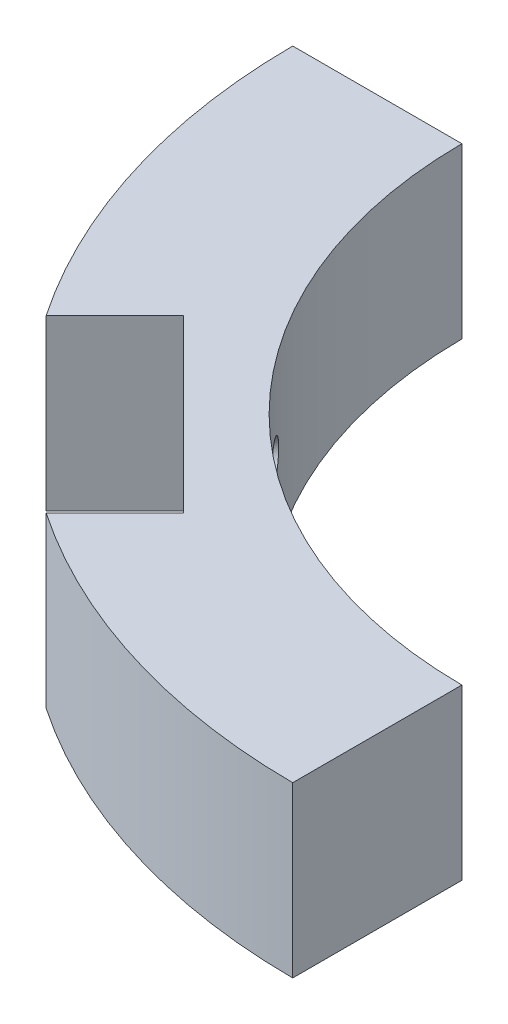
ISO-10303-21;
HEADER;
FILE_DESCRIPTION(('STEP AP214'),'2;1');
FILE_NAME('part.step','',(''),(''),'','','');
FILE_SCHEMA(('AUTOMOTIVE_DESIGN { 1 0 10303 214 1 1 1 1 }'));
ENDSEC;
DATA;
#1=APPLICATION_CONTEXT('core data for automotive mechanical design processes');
#2=APPLICATION_PROTOCOL_DEFINITION('international standard','automotive_design',2000,#1);
#3=PRODUCT_CONTEXT('',#1,'mechanical');
#4=PRODUCT('Part','Part','',(#3));
#5=PRODUCT_RELATED_PRODUCT_CATEGORY('part','',(#4));
#6=PRODUCT_DEFINITION_FORMATION('','',#4);
#7=PRODUCT_DEFINITION_CONTEXT('part definition',#1,'design');
#8=PRODUCT_DEFINITION('design','',#6,#7);
#9=PRODUCT_DEFINITION_SHAPE('','',#8);
#10=(LENGTH_UNIT() NAMED_UNIT(*) SI_UNIT(.MILLI.,.METRE.));
#11=(NAMED_UNIT(*) PLANE_ANGLE_UNIT() SI_UNIT($,.RADIAN.));
#12=(NAMED_UNIT(*) SI_UNIT($,.STERADIAN.) SOLID_ANGLE_UNIT());
#13=UNCERTAINTY_MEASURE_WITH_UNIT(LENGTH_MEASURE(1.E-05),#10,'distance_accuracy_value','');
#14=(GEOMETRIC_REPRESENTATION_CONTEXT(3) GLOBAL_UNCERTAINTY_ASSIGNED_CONTEXT((#13)) GLOBAL_UNIT_ASSIGNED_CONTEXT((#10,
#11,#12)) REPRESENTATION_CONTEXT('',''));
#15=CARTESIAN_POINT('',(0.,0.,0.));
#16=DIRECTION('',(0.,0.,1.));
#17=DIRECTION('',(1.,0.,0.));
#18=AXIS2_PLACEMENT_3D('',#15,#16,#17);
#19=CARTESIAN_POINT('',(0.,3.5,0.));
#20=DIRECTION('',(0.,-1.,0.));
#21=DIRECTION('',(0.,0.,-1.));
#22=AXIS2_PLACEMENT_3D('',#19,#20,#21);
#23=CYLINDRICAL_SURFACE('',#22,26.5);
#24=CARTESIAN_POINT('',(0.,3.5,0.));
#25=DIRECTION('',(0.,1.,0.));
#26=DIRECTION('',(0.,0.,1.));
#27=AXIS2_PLACEMENT_3D('',#24,#25,#26);
#28=CIRCLE('',#27,26.5);
#29=CARTESIAN_POINT('',(-14.8662323136452,3.5,21.9373001255107));
#30=VERTEX_POINT('',#29);
#31=CARTESIAN_POINT('',(-0.0999999999999968,3.5,26.499811320083));
#32=VERTEX_POINT('',#31);
#33=EDGE_CURVE('E99',#30,#32,#28,.T.);
#34=ORIENTED_EDGE('',*,*,#33,.F.);
#35=DIRECTION('',(0.,-1.,0.));
#36=VECTOR('',#35,1.);
#37=CARTESIAN_POINT('',(-14.8662323136452,3.5,21.9373001255107));
#38=LINE('',#37,#36);
#39=CARTESIAN_POINT('',(-14.8662323136452,-3.5,21.9373001255107));
#40=VERTEX_POINT('',#39);
#41=EDGE_CURVE('E150',#30,#40,#38,.T.);
#42=ORIENTED_EDGE('',*,*,#41,.T.);
#43=CARTESIAN_POINT('',(0.,-3.5,0.));
#44=DIRECTION('',(0.,1.,0.));
#45=DIRECTION('',(0.,0.,1.));
#46=AXIS2_PLACEMENT_3D('',#43,#44,#45);
#47=CIRCLE('',#46,26.5);
#48=CARTESIAN_POINT('',(-0.0999999999999968,-3.5,26.499811320083));
#49=VERTEX_POINT('',#48);
#50=EDGE_CURVE('E142',#40,#49,#47,.T.);
#51=ORIENTED_EDGE('',*,*,#50,.T.);
#52=DIRECTION('',(0.,-1.,0.));
#53=VECTOR('',#52,1.);
#54=CARTESIAN_POINT('',(-0.0999999999999968,3.5,26.499811320083));
#55=LINE('',#54,#53);
#56=EDGE_CURVE('E54',#32,#49,#55,.T.);
#57=ORIENTED_EDGE('',*,*,#56,.F.);
#58=EDGE_LOOP('',(#34,#42,#51,#57));
#59=FACE_BOUND('',#58,.T.);
#60=ADVANCED_FACE('F39',(#59),#23,.T.);
#61=CARTESIAN_POINT('',(-26.499811320083,-3.5,0.100000000000003));
#62=VERTEX_POINT('',#61);
#63=CARTESIAN_POINT('',(-21.9373001255107,-3.5,14.8662323136452));
#64=VERTEX_POINT('',#63);
#65=EDGE_CURVE('E149',#62,#64,#47,.T.);
#66=ORIENTED_EDGE('',*,*,#65,.T.);
#67=DIRECTION('',(0.,-1.,0.));
#68=VECTOR('',#67,1.);
#69=CARTESIAN_POINT('',(-21.9373001255107,3.5,14.8662323136452));
#70=LINE('',#69,#68);
#71=CARTESIAN_POINT('',(-21.9373001255107,3.5,14.8662323136452));
#72=VERTEX_POINT('',#71);
#73=EDGE_CURVE('E155',#64,#72,#70,.F.);
#74=ORIENTED_EDGE('',*,*,#73,.T.);
#75=CARTESIAN_POINT('',(-26.499811320083,3.5,0.100000000000003));
#76=VERTEX_POINT('',#75);
#77=EDGE_CURVE('E221',#76,#72,#28,.T.);
#78=ORIENTED_EDGE('',*,*,#77,.F.);
#79=DIRECTION('',(0.,-1.,0.));
#80=VECTOR('',#79,1.);
#81=CARTESIAN_POINT('',(-26.499811320083,3.5,0.100000000000003));
#82=LINE('',#81,#80);
#83=EDGE_CURVE('E167',#76,#62,#82,.T.);
#84=ORIENTED_EDGE('',*,*,#83,.T.);
#85=EDGE_LOOP('',(#66,#74,#78,#84));
#86=FACE_BOUND('',#85,.T.);
#87=ADVANCED_FACE('F41',(#86),#23,.T.);
#88=CARTESIAN_POINT('',(-0.0999999999999976,3.5,19.4997435880578));
#89=DIRECTION('',(-1.,0.,0.));
#90=DIRECTION('',(0.,0.,1.));
#91=AXIS2_PLACEMENT_3D('',#88,#89,#90);
#92=PLANE('',#91);
#93=DIRECTION('',(0.,0.,-1.));
#94=VECTOR('',#93,1.);
#95=CARTESIAN_POINT('',(-0.0999999999999976,-3.5,19.4997435880578));
#96=LINE('',#95,#94);
#97=CARTESIAN_POINT('',(-0.0999999999999976,-3.5,19.4997435880578));
#98=VERTEX_POINT('',#97);
#99=EDGE_CURVE('E144',#49,#98,#96,.T.);
#100=ORIENTED_EDGE('',*,*,#99,.T.);
#101=DIRECTION('',(0.,-1.,0.));
#102=VECTOR('',#101,1.);
#103=CARTESIAN_POINT('',(-0.0999999999999976,3.5,19.4997435880578));
#104=LINE('',#103,#102);
#105=CARTESIAN_POINT('',(-0.0999999999999976,3.5,19.4997435880578));
#106=VERTEX_POINT('',#105);
#107=EDGE_CURVE('E173',#106,#98,#104,.T.);
#108=ORIENTED_EDGE('',*,*,#107,.F.);
#109=DIRECTION('',(0.,0.,-1.));
#110=VECTOR('',#109,1.);
#111=CARTESIAN_POINT('',(-0.0999999999999976,3.5,19.4997435880578));
#112=LINE('',#111,#110);
#113=EDGE_CURVE('E224',#32,#106,#112,.T.);
#114=ORIENTED_EDGE('',*,*,#113,.F.);
#115=ORIENTED_EDGE('',*,*,#56,.T.);
#116=EDGE_LOOP('',(#100,#108,#114,#115));
#117=FACE_BOUND('',#116,.T.);
#118=ADVANCED_FACE('F213',(#117),#92,.F.);
#119=CARTESIAN_POINT('',(0.,3.5,0.));
#120=DIRECTION('',(0.,-1.,0.));
#121=DIRECTION('',(0.,0.,-1.));
#122=AXIS2_PLACEMENT_3D('',#119,#120,#121);
#123=CYLINDRICAL_SURFACE('',#122,19.5);
#124=CARTESIAN_POINT('',(-14.9381653949713,0.,12.5340023389371));
#125=CARTESIAN_POINT('',(-14.9381667780686,0.0447926887067032,12.5340009062882));
#126=CARTESIAN_POINT('',(-14.940601786529,0.0896174151561325,12.5311003946035));
#127=CARTESIAN_POINT('',(-14.9502708829078,0.178030383018517,12.5195628914961));
#128=CARTESIAN_POINT('',(-14.9575106622341,0.221617094034541,12.5109190969531));
#129=CARTESIAN_POINT('',(-14.9765506304799,0.306259561267728,12.4881203751009));
#130=CARTESIAN_POINT('',(-14.9883484445512,0.347316622599621,12.4739683177038));
#131=CARTESIAN_POINT('',(-15.0161174144119,0.425747881223164,12.4405260283543));
#132=CARTESIAN_POINT('',(-15.0320875509083,0.463122974948067,12.4212370513226));
#133=CARTESIAN_POINT('',(-15.0677106128549,0.533196901395608,12.3779998420985));
#134=CARTESIAN_POINT('',(-15.0873680784392,0.565889880663399,12.3540458645801));
#135=CARTESIAN_POINT('',(-15.1297296402066,0.625634218496681,12.30212994319));
#136=CARTESIAN_POINT('',(-15.1524338907005,0.652685291138801,12.2741677963114));
#137=CARTESIAN_POINT('',(-15.200269382794,0.70048845302892,12.2148788162801));
#138=CARTESIAN_POINT('',(-15.2254090629831,0.721217527781188,12.1835402386997));
#139=CARTESIAN_POINT('',(-15.2772811307708,0.755686299213845,12.1184327458993));
#140=CARTESIAN_POINT('',(-15.3040135632259,0.769425798943669,12.0846637622264));
#141=CARTESIAN_POINT('',(-15.3584470765087,0.789619559561356,12.0154090088681));
#142=CARTESIAN_POINT('',(-15.3861530238841,0.796029418390657,11.9799141196695));
#143=CARTESIAN_POINT('',(-15.4415822781847,0.801261046419452,11.9083829344446));
#144=CARTESIAN_POINT('',(-15.4693055857741,0.800082504958599,11.872346616313));
#145=CARTESIAN_POINT('',(-15.5241870766144,0.790154617626917,11.8004946302563));
#146=CARTESIAN_POINT('',(-15.5513400872486,0.781353461705406,11.7646821652043));
#147=CARTESIAN_POINT('',(-15.6041430890249,0.75636462196657,11.6945562719919));
#148=CARTESIAN_POINT('',(-15.6297930286496,0.740176685135969,11.6602428952226));
#149=CARTESIAN_POINT('',(-15.6789944202361,0.700790736440036,11.5940003415255));
#150=CARTESIAN_POINT('',(-15.7025381267873,0.677568125894556,11.5620800292853));
#151=CARTESIAN_POINT('',(-15.7468018344436,0.624770398574442,11.5017231263902));
#152=CARTESIAN_POINT('',(-15.7675218649236,0.595195347892925,11.4732864994946));
#153=CARTESIAN_POINT('',(-15.8055127174139,0.530642657884267,11.420893705515));
#154=CARTESIAN_POINT('',(-15.8227973646052,0.495687720954634,11.3969196054694));
#155=CARTESIAN_POINT('',(-15.8535648475609,0.421263333317196,11.3540820649097));
#156=CARTESIAN_POINT('',(-15.8670479304329,0.381794176275341,11.3352182922194));
#157=CARTESIAN_POINT('',(-15.8897176516203,0.299945745038172,11.3034177040642));
#158=CARTESIAN_POINT('',(-15.8989520798266,0.257605314065336,11.2904149974524));
#159=CARTESIAN_POINT('',(-15.9131034795064,0.170829223204259,11.270460896307));
#160=CARTESIAN_POINT('',(-15.9180207925848,0.126393729387535,11.263509022983));
#161=CARTESIAN_POINT('',(-15.9233721370508,0.0372653435309439,11.255942486705));
#162=CARTESIAN_POINT('',(-15.9238596712659,-0.007417935803391,11.2552521965781));
#163=CARTESIAN_POINT('',(-15.9204784963119,-0.0962858662053033,11.2600343144363));
#164=CARTESIAN_POINT('',(-15.9166099345456,-0.140470534093941,11.2655065138934));
#165=CARTESIAN_POINT('',(-15.9046437313152,-0.226911488059198,11.282393945902));
#166=CARTESIAN_POINT('',(-15.8965627109719,-0.269174648372177,11.2937858206073));
#167=CARTESIAN_POINT('',(-15.8763927453055,-0.350780818016871,11.3221223321958));
#168=CARTESIAN_POINT('',(-15.8643036797798,-0.390123739726423,11.3390671356127));
#169=CARTESIAN_POINT('',(-15.8363280618732,-0.465084120177275,11.3781058218266));
#170=CARTESIAN_POINT('',(-15.8204150798007,-0.500673053915882,11.4002355130632));
#171=CARTESIAN_POINT('',(-15.7852440962625,-0.566844626809012,11.4488849962167));
#172=CARTESIAN_POINT('',(-15.7659858669314,-0.597426924655128,11.4754050871847));
#173=CARTESIAN_POINT('',(-15.7243436239521,-0.653131795604779,11.5324011684197));
#174=CARTESIAN_POINT('',(-15.7019227228704,-0.678179396169699,11.5629234898));
#175=CARTESIAN_POINT('',(-15.6547240595134,-0.721638301572632,11.6267445234585));
#176=CARTESIAN_POINT('',(-15.6299461597275,-0.74004921891696,11.6600433977106));
#177=CARTESIAN_POINT('',(-15.5784239921698,-0.769884220384496,11.7287922424816));
#178=CARTESIAN_POINT('',(-15.5516627391421,-0.781237595753329,11.7642601913367));
#179=CARTESIAN_POINT('',(-15.4971179346211,-0.796346708849048,11.8360198636244));
#180=CARTESIAN_POINT('',(-15.469334363194,-0.800102298348236,11.8723116031148));
#181=CARTESIAN_POINT('',(-15.4134685669638,-0.799893268563037,11.9447512549184));
#182=CARTESIAN_POINT('',(-15.3853858849238,-0.795914361243836,11.980898777202));
#183=CARTESIAN_POINT('',(-15.3297883795077,-0.780295549953545,12.0519551920139));
#184=CARTESIAN_POINT('',(-15.3022735444758,-0.768655803391906,12.0868641099767));
#185=CARTESIAN_POINT('',(-15.2487709295146,-0.738096488900711,12.1542926606039));
#186=CARTESIAN_POINT('',(-15.2227763551842,-0.719212709721057,12.1868231177741));
#187=CARTESIAN_POINT('',(-15.1729727025359,-0.674678325852769,12.2487746694918));
#188=CARTESIAN_POINT('',(-15.1491634602423,-0.649028229433325,12.2781959973571));
#189=CARTESIAN_POINT('',(-15.1046431727114,-0.591884726195248,12.3329231206628));
#190=CARTESIAN_POINT('',(-15.0839114345638,-0.560433865970018,12.3582565138407));
#191=CARTESIAN_POINT('',(-15.0460064603107,-0.492447897996263,12.404377587756));
#192=CARTESIAN_POINT('',(-15.0288339950034,-0.455911691819864,12.4251642839119));
#193=CARTESIAN_POINT('',(-14.9986895506647,-0.37900079134491,12.4615355718145));
#194=CARTESIAN_POINT('',(-14.9856972351844,-0.33864595612349,12.4771453610296));
#195=CARTESIAN_POINT('',(-14.9642342589253,-0.255123763596308,12.5028787284016));
#196=CARTESIAN_POINT('',(-14.9557581464211,-0.211959868231087,12.5130089214679));
#197=CARTESIAN_POINT('',(-14.9458518821573,-0.140434863682562,12.5248370970091));
#198=CARTESIAN_POINT('',(-14.9429735630656,-0.112540972881949,12.5282700394258));
#199=CARTESIAN_POINT('',(-14.9391298851349,-0.0564356277711274,12.5328531100659));
#200=CARTESIAN_POINT('',(-14.9381645234725,-0.0282241739296987,12.5340032416587));
#201=CARTESIAN_POINT('',(-14.9381653949713,0.,12.5340023389371));
#202=B_SPLINE_CURVE_WITH_KNOTS('',3,(#124,#125,#126,#127,#128,#129,#130,#131,#132,#133,#134,
#135,#136,#137,#138,#139,#140,#141,#142,#143,#144,#145,#146,#147,#148,#149,#150,#151,#152,#153,
#154,#155,#156,#157,#158,#159,#160,#161,#162,#163,#164,#165,#166,#167,#168,#169,#170,#171,#172,
#173,#174,#175,#176,#177,#178,#179,#180,#181,#182,#183,#184,#185,#186,#187,#188,#189,#190,#191,
#192,#193,#194,#195,#196,#197,#198,#199,#200,#201),.UNSPECIFIED.,.T.,.F.,(4,2,2,2,2,2,2,2,2,2,2,
2,2,2,2,2,2,2,2,2,2,2,2,2,2,2,2,2,2,2,2,2,2,2,2,2,2,2,4),(0.,0.134274968871725,
0.268709275390316,0.403073632580654,0.537405195374185,0.671903256723807,0.806408132578212,
0.941396968596201,1.07638960808652,1.21219575473568,1.34800746116708,1.48474957379641,
1.62149637049145,1.75872697073489,1.89595614325003,2.0326213482637,2.16927766777484,
2.30435681958522,2.43942528187961,2.57286018754196,2.70629057813082,2.83919843274955,
2.97211027367612,3.10596860943248,3.23983606667657,3.37541868829253,3.51100922484157,
3.64793721310396,3.78486787271365,3.92205172648165,4.05923276158187,4.19574461247371,
4.33224621184802,4.46778379474357,4.60335069913835,4.73824773093714,4.8729815509876,
4.95758923538794,5.04219679490854),.UNSPECIFIED.);
#203=CARTESIAN_POINT('',(-14.9381653949713,0.,12.5340023389371));
#204=VERTEX_POINT('',#203);
#205=EDGE_CURVE('E43',#204,#204,#202,.T.);
#206=ORIENTED_EDGE('',*,*,#205,.T.);
#207=EDGE_LOOP('',(#206));
#208=FACE_BOUND('',#207,.T.);
#209=CARTESIAN_POINT('',(-11.2562496055717,0.,15.923154361403));
#210=CARTESIAN_POINT('',(-11.2562513989547,0.0444882603622283,15.923153262429));
#211=CARTESIAN_POINT('',(-11.2593361298349,0.0890086003418468,15.9209738533562));
#212=CARTESIAN_POINT('',(-11.2715814252711,0.17681236621352,15.9123067526694));
#213=CARTESIAN_POINT('',(-11.2807492348988,0.220094252883904,15.9058139236725));
#214=CARTESIAN_POINT('',(-11.3048468799743,0.304126780095141,15.8886957932278));
#215=CARTESIAN_POINT('',(-11.3197719435446,0.344879484550197,15.8780739140707));
#216=CARTESIAN_POINT('',(-11.3548927837817,0.422750549666529,15.8529768013485));
#217=CARTESIAN_POINT('',(-11.3750874752577,0.459869656444034,15.838502361141));
#218=CARTESIAN_POINT('',(-11.4202776055081,0.529738576288484,15.8059494565509));
#219=CARTESIAN_POINT('',(-11.4453070772825,0.562454445970485,15.7878454061571));
#220=CARTESIAN_POINT('',(-11.4993015218041,0.622319780119209,15.7485611144964));
#221=CARTESIAN_POINT('',(-11.5282668939615,0.64946867895422,15.7273805610147));
#222=CARTESIAN_POINT('',(-11.58966472861,0.697788219043295,15.6821918281202));
#223=CARTESIAN_POINT('',(-11.6221367544623,0.718878061134497,15.6581509837661));
#224=CARTESIAN_POINT('',(-11.689280707098,0.75404014908192,15.608089850927));
#225=CARTESIAN_POINT('',(-11.7239527402789,0.768112055242816,15.5820694666947));
#226=CARTESIAN_POINT('',(-11.7947696003497,0.788928865744334,15.5285348276059));
#227=CARTESIAN_POINT('',(-11.8309236424234,0.795617075674029,15.501010693682));
#228=CARTESIAN_POINT('',(-11.9034143621222,0.801272664511802,15.4454139703401));
#229=CARTESIAN_POINT('',(-11.939751039974,0.800240033828525,15.4173413802408));
#230=CARTESIAN_POINT('',(-12.0115512339807,0.790463942969342,15.3614682033334));
#231=CARTESIAN_POINT('',(-12.0470152852696,0.781725336032816,15.3336674564585));
#232=CARTESIAN_POINT('',(-12.1160918129241,0.756765494190017,15.2791444915054));
#233=CARTESIAN_POINT('',(-12.1497043422757,0.740544473536647,15.2524222425691));
#234=CARTESIAN_POINT('',(-12.2139381478425,0.70117989102477,15.2010328101872));
#235=CARTESIAN_POINT('',(-12.2445763155069,0.678078872231745,15.176354155167));
#236=CARTESIAN_POINT('',(-12.3022446140576,0.625559421838201,15.129644958093));
#237=CARTESIAN_POINT('',(-12.3292748760735,0.596141219937747,15.1076143197997));
#238=CARTESIAN_POINT('',(-12.378819006432,0.532037399755519,15.0670455242559));
#239=CARTESIAN_POINT('',(-12.4013620752591,0.497388603767978,15.0484848377862));
#240=CARTESIAN_POINT('',(-12.4415534860614,0.42366138142606,15.0152731843781));
#241=CARTESIAN_POINT('',(-12.4592019545865,0.384583069633649,15.0006221163569));
#242=CARTESIAN_POINT('',(-12.4890655194484,0.303302873093291,14.9757677602491));
#243=CARTESIAN_POINT('',(-12.5013054488625,0.261116324516301,14.9655441480993));
#244=CARTESIAN_POINT('',(-12.5201513692255,0.174661067535276,14.9497813340595));
#245=CARTESIAN_POINT('',(-12.5267574399285,0.130392388615719,14.9442420658569));
#246=CARTESIAN_POINT('',(-12.5341555885122,0.0411369925096781,14.9380376025166));
#247=CARTESIAN_POINT('',(-12.5349607894451,-0.00384787307781429,14.9373614058722));
#248=CARTESIAN_POINT('',(-12.5307711865429,-0.093354814241568,14.9408761678379));
#249=CARTESIAN_POINT('',(-12.5257764178699,-0.137876892621808,14.9450670969412));
#250=CARTESIAN_POINT('',(-12.5101202215359,-0.225170737623737,14.9581748587763));
#251=CARTESIAN_POINT('',(-12.4994617533651,-0.267943405816575,14.9670892233336));
#252=CARTESIAN_POINT('',(-12.4727567551295,-0.350551866570748,14.989350865013));
#253=CARTESIAN_POINT('',(-12.4567102273285,-0.390387660365992,15.0026981402728));
#254=CARTESIAN_POINT('',(-12.4196307616803,-0.466035515175262,15.0334077823465));
#255=CARTESIAN_POINT('',(-12.3985930664982,-0.501843688963106,15.0507739794086));
#256=CARTESIAN_POINT('',(-12.3520952177479,-0.568388545403883,15.0889577622282));
#257=CARTESIAN_POINT('',(-12.3266350238901,-0.599125181849311,15.1097753794287));
#258=CARTESIAN_POINT('',(-12.2718917036601,-0.654755485097515,15.1542706625385));
#259=CARTESIAN_POINT('',(-12.242597835861,-0.679632163250609,15.1779563499035));
#260=CARTESIAN_POINT('',(-12.181034486075,-0.722749321178305,15.2274080485627));
#261=CARTESIAN_POINT('',(-12.1487649352695,-0.740989647426168,15.2531741079678));
#262=CARTESIAN_POINT('',(-12.0819489158533,-0.770427261873299,15.3061535400458));
#263=CARTESIAN_POINT('',(-12.0473912784662,-0.781586681310462,15.3333738643003));
#264=CARTESIAN_POINT('',(-11.9771057465913,-0.796423696104602,15.3883373948898));
#265=CARTESIAN_POINT('',(-11.941377802802,-0.800100975848621,15.4160806232322));
#266=CARTESIAN_POINT('',(-11.8694934190225,-0.799894087392364,15.4714963576925));
#267=CARTESIAN_POINT('',(-11.8333357250625,-0.79595737860279,15.4991670435424));
#268=CARTESIAN_POINT('',(-11.7618613965189,-0.78054373904679,15.553476528203));
#269=CARTESIAN_POINT('',(-11.726544796566,-0.76906649836463,15.5801152845538));
#270=CARTESIAN_POINT('',(-11.6575892545338,-0.738815855356357,15.6317778772307));
#271=CARTESIAN_POINT('',(-11.6239599183035,-0.720005079466371,15.656792663145));
#272=CARTESIAN_POINT('',(-11.5595740670861,-0.675609428118719,15.7043895841664));
#273=CARTESIAN_POINT('',(-11.5288174639403,-0.650024760631485,15.726971793928));
#274=CARTESIAN_POINT('',(-11.4711573745523,-0.592825679326733,15.769078076246));
#275=CARTESIAN_POINT('',(-11.4442482528643,-0.5612202459024,15.7886066255421));
#276=CARTESIAN_POINT('',(-11.3950733929839,-0.492819504523564,15.8241342673123));
#277=CARTESIAN_POINT('',(-11.3728085806775,-0.456023164160033,15.8401326560528));
#278=CARTESIAN_POINT('',(-11.3338414237774,-0.378648814871189,15.8680373571669));
#279=CARTESIAN_POINT('',(-11.3170900905247,-0.338108450998922,15.8799797402928));
#280=CARTESIAN_POINT('',(-11.2894500401071,-0.254149508648306,15.8996417699566));
#281=CARTESIAN_POINT('',(-11.2785537225385,-0.210734744111615,15.9073668911369));
#282=CARTESIAN_POINT('',(-11.2659446837547,-0.139187939141677,15.9162973885428));
#283=CARTESIAN_POINT('',(-11.2623143872689,-0.111542334174153,15.91886564967));
#284=CARTESIAN_POINT('',(-11.2574662948808,-0.0559353788880285,15.9222944741549));
#285=CARTESIAN_POINT('',(-11.2562484779001,-0.0279740313303002,15.9231550524332));
#286=CARTESIAN_POINT('',(-11.2562496055717,0.,15.923154361403));
#287=B_SPLINE_CURVE_WITH_KNOTS('',3,(#209,#210,#211,#212,#213,#214,#215,#216,#217,#218,#219,
#220,#221,#222,#223,#224,#225,#226,#227,#228,#229,#230,#231,#232,#233,#234,#235,#236,#237,#238,
#239,#240,#241,#242,#243,#244,#245,#246,#247,#248,#249,#250,#251,#252,#253,#254,#255,#256,#257,
#258,#259,#260,#261,#262,#263,#264,#265,#266,#267,#268,#269,#270,#271,#272,#273,#274,#275,#276,
#277,#278,#279,#280,#281,#282,#283,#284,#285,#286),.UNSPECIFIED.,.T.,.F.,(4,2,2,2,2,2,2,2,2,2,2,
2,2,2,2,2,2,2,2,2,2,2,2,2,2,2,2,2,2,2,2,2,2,2,2,2,2,2,4),(0.,0.133361839352201,
0.266882801186459,0.400293331664344,0.533676410153089,0.668035071461231,0.802407377515444,
0.938496213348162,1.07459163576929,1.21172492785527,1.34885839029764,1.48590554744275,
1.62294878059624,1.75916159390531,1.89536945519775,2.03065967207611,2.16594639069892,
2.30060532260018,2.43526234820692,2.5696146492158,2.70396613572332,2.83824748760361,
2.97252878306618,3.10693858672213,3.24134961493747,3.37614564697282,3.51094479720921,
3.64645890991594,3.78197873878475,3.91843706411698,4.05490099823497,4.19206967483966,
4.32923414061206,4.46619559560725,4.60318432909538,4.7389207810206,4.87448060498398,
4.95833870233798,5.04219606699845),.UNSPECIFIED.);
#288=CARTESIAN_POINT('',(-11.2562496055717,0.,15.923154361403));
#289=VERTEX_POINT('',#288);
#290=EDGE_CURVE('E178',#289,#289,#287,.T.);
#291=ORIENTED_EDGE('',*,*,#290,.T.);
#292=EDGE_LOOP('',(#291));
#293=FACE_BOUND('',#292,.T.);
#294=CARTESIAN_POINT('',(0.,-3.5,0.));
#295=DIRECTION('',(0.,-1.,0.));
#296=DIRECTION('',(0.,0.,1.));
#297=AXIS2_PLACEMENT_3D('',#294,#295,#296);
#298=CIRCLE('',#297,19.5);
#299=CARTESIAN_POINT('',(-19.4997435880578,-3.5,0.100000000000004));
#300=VERTEX_POINT('',#299);
#301=EDGE_CURVE('E162',#98,#300,#298,.T.);
#302=ORIENTED_EDGE('',*,*,#301,.T.);
#303=DIRECTION('',(0.,-1.,0.));
#304=VECTOR('',#303,1.);
#305=CARTESIAN_POINT('',(-19.4997435880578,3.5,0.100000000000004));
#306=LINE('',#305,#304);
#307=CARTESIAN_POINT('',(-19.4997435880578,3.5,0.100000000000004));
#308=VERTEX_POINT('',#307);
#309=EDGE_CURVE('E170',#308,#300,#306,.T.);
#310=ORIENTED_EDGE('',*,*,#309,.F.);
#311=CARTESIAN_POINT('',(0.,3.5,0.));
#312=DIRECTION('',(0.,-1.,0.));
#313=DIRECTION('',(0.,0.,1.));
#314=AXIS2_PLACEMENT_3D('',#311,#312,#313);
#315=CIRCLE('',#314,19.5);
#316=EDGE_CURVE('E228',#106,#308,#315,.T.);
#317=ORIENTED_EDGE('',*,*,#316,.F.);
#318=ORIENTED_EDGE('',*,*,#107,.T.);
#319=EDGE_LOOP('',(#302,#310,#317,#318));
#320=FACE_BOUND('',#319,.T.);
#321=ADVANCED_FACE('F186',(#208,#293,#320),#123,.F.);
#322=CARTESIAN_POINT('',(-19.4997435880578,3.5,0.100000000000002));
#323=DIRECTION('',(0.,0.,1.));
#324=DIRECTION('',(1.,0.,0.));
#325=AXIS2_PLACEMENT_3D('',#322,#323,#324);
#326=PLANE('',#325);
#327=DIRECTION('',(-1.,0.,0.));
#328=VECTOR('',#327,1.);
#329=CARTESIAN_POINT('',(-19.4997435880578,-3.5,0.100000000000002));
#330=LINE('',#329,#328);
#331=EDGE_CURVE('E92',#300,#62,#330,.T.);
#332=ORIENTED_EDGE('',*,*,#331,.T.);
#333=ORIENTED_EDGE('',*,*,#83,.F.);
#334=DIRECTION('',(-1.,0.,0.));
#335=VECTOR('',#334,1.);
#336=CARTESIAN_POINT('',(-19.4997435880578,3.5,0.100000000000002));
#337=LINE('',#336,#335);
#338=EDGE_CURVE('E71',#308,#76,#337,.T.);
#339=ORIENTED_EDGE('',*,*,#338,.F.);
#340=ORIENTED_EDGE('',*,*,#309,.T.);
#341=EDGE_LOOP('',(#332,#333,#339,#340));
#342=FACE_BOUND('',#341,.T.);
#343=ADVANCED_FACE('F207',(#342),#326,.F.);
#344=CARTESIAN_POINT('',(0.,3.5,0.));
#345=DIRECTION('',(0.,1.,0.));
#346=DIRECTION('',(0.,0.,1.));
#347=AXIS2_PLACEMENT_3D('',#344,#345,#346);
#348=PLANE('',#347);
#349=DIRECTION('',(0.707106781186549,0.,-0.707106781186546));
#350=VECTOR('',#349,1.);
#351=CARTESIAN_POINT('',(-12.0208152801713,3.5,19.0918830920368));
#352=LINE('',#351,#350);
#353=CARTESIAN_POINT('',(-12.0208152801713,3.5,19.0918830920368));
#354=VERTEX_POINT('',#353);
#355=EDGE_CURVE('E125',#30,#354,#352,.T.);
#356=ORIENTED_EDGE('',*,*,#355,.F.);
#357=ORIENTED_EDGE('',*,*,#33,.T.);
#358=ORIENTED_EDGE('',*,*,#113,.T.);
#359=ORIENTED_EDGE('',*,*,#316,.T.);
#360=ORIENTED_EDGE('',*,*,#338,.T.);
#361=ORIENTED_EDGE('',*,*,#77,.T.);
#362=DIRECTION('',(-0.707106781186547,0.,0.707106781186548));
#363=VECTOR('',#362,1.);
#364=CARTESIAN_POINT('',(-22.2738636073762,3.5,15.2027957955108));
#365=LINE('',#364,#363);
#366=CARTESIAN_POINT('',(-19.0918830920368,3.5,12.0208152801713));
#367=VERTEX_POINT('',#366);
#368=EDGE_CURVE('E137',#367,#72,#365,.T.);
#369=ORIENTED_EDGE('',*,*,#368,.F.);
#370=DIRECTION('',(-0.707106781186548,0.,-0.707106781186547));
#371=VECTOR('',#370,1.);
#372=CARTESIAN_POINT('',(-19.0918830920368,3.5,12.0208152801713));
#373=LINE('',#372,#371);
#374=EDGE_CURVE('E239',#354,#367,#373,.T.);
#375=ORIENTED_EDGE('',*,*,#374,.F.);
#376=EDGE_LOOP('',(#356,#357,#358,#359,#360,#361,#369,#375));
#377=FACE_BOUND('',#376,.T.);
#378=ADVANCED_FACE('F204',(#377),#348,.T.);
#379=CARTESIAN_POINT('',(0.,-3.5,0.));
#380=DIRECTION('',(0.,1.,0.));
#381=DIRECTION('',(0.,0.,1.));
#382=AXIS2_PLACEMENT_3D('',#379,#380,#381);
#383=PLANE('',#382);
#384=ORIENTED_EDGE('',*,*,#50,.F.);
#385=DIRECTION('',(0.707106781186549,0.,-0.707106781186546));
#386=VECTOR('',#385,1.);
#387=CARTESIAN_POINT('',(3.53553390593277,-3.5,3.53553390593279));
#388=LINE('',#387,#386);
#389=CARTESIAN_POINT('',(-12.0208152801713,-3.5,19.0918830920368));
#390=VERTEX_POINT('',#389);
#391=EDGE_CURVE('E11',#40,#390,#388,.T.);
#392=ORIENTED_EDGE('',*,*,#391,.T.);
#393=DIRECTION('',(-0.707106781186548,0.,-0.707106781186547));
#394=VECTOR('',#393,1.);
#395=CARTESIAN_POINT('',(-19.0918830920368,-3.5,12.0208152801713));
#396=LINE('',#395,#394);
#397=CARTESIAN_POINT('',(-19.0918830920368,-3.5,12.0208152801713));
#398=VERTEX_POINT('',#397);
#399=EDGE_CURVE('E133',#390,#398,#396,.T.);
#400=ORIENTED_EDGE('',*,*,#399,.T.);
#401=DIRECTION('',(-0.707106781186547,0.,0.707106781186548));
#402=VECTOR('',#401,1.);
#403=CARTESIAN_POINT('',(-22.2738636073762,-3.5,15.2027957955108));
#404=LINE('',#403,#402);
#405=EDGE_CURVE('E62',#398,#64,#404,.T.);
#406=ORIENTED_EDGE('',*,*,#405,.T.);
#407=ORIENTED_EDGE('',*,*,#65,.F.);
#408=ORIENTED_EDGE('',*,*,#331,.F.);
#409=ORIENTED_EDGE('',*,*,#301,.F.);
#410=ORIENTED_EDGE('',*,*,#99,.F.);
#411=EDGE_LOOP('',(#384,#392,#400,#406,#407,#408,#409,#410));
#412=FACE_BOUND('',#411,.T.);
#413=ADVANCED_FACE('F140',(#412),#383,.F.);
#414=CARTESIAN_POINT('',(-12.0208152801713,-3.5,19.0918830920368));
#415=DIRECTION('',(0.707106781186546,0.,0.707106781186549));
#416=DIRECTION('',(0.707106781186549,0.,-0.707106781186546));
#417=AXIS2_PLACEMENT_3D('',#414,#415,#416);
#418=PLANE('',#417);
#419=ORIENTED_EDGE('',*,*,#355,.T.);
#420=DIRECTION('',(0.,1.,0.));
#421=VECTOR('',#420,1.);
#422=CARTESIAN_POINT('',(-12.0208152801713,-3.5,19.0918830920368));
#423=LINE('',#422,#421);
#424=EDGE_CURVE('E121',#390,#354,#423,.T.);
#425=ORIENTED_EDGE('',*,*,#424,.F.);
#426=ORIENTED_EDGE('',*,*,#391,.F.);
#427=ORIENTED_EDGE('',*,*,#41,.F.);
#428=EDGE_LOOP('',(#419,#425,#426,#427));
#429=FACE_BOUND('',#428,.T.);
#430=ADVANCED_FACE('F123',(#429),#418,.F.);
#431=CARTESIAN_POINT('',(-22.2738636073762,-3.5,15.2027957955108));
#432=DIRECTION('',(-0.707106781186548,0.,-0.707106781186547));
#433=DIRECTION('',(-0.707106781186547,0.,0.707106781186548));
#434=AXIS2_PLACEMENT_3D('',#431,#432,#433);
#435=PLANE('',#434);
#436=ORIENTED_EDGE('',*,*,#405,.F.);
#437=DIRECTION('',(0.,1.,0.));
#438=VECTOR('',#437,1.);
#439=CARTESIAN_POINT('',(-19.0918830920368,-3.5,12.0208152801713));
#440=LINE('',#439,#438);
#441=EDGE_CURVE('E130',#398,#367,#440,.T.);
#442=ORIENTED_EDGE('',*,*,#441,.T.);
#443=ORIENTED_EDGE('',*,*,#368,.T.);
#444=ORIENTED_EDGE('',*,*,#73,.F.);
#445=EDGE_LOOP('',(#436,#442,#443,#444));
#446=FACE_BOUND('',#445,.T.);
#447=ADVANCED_FACE('F196',(#446),#435,.F.);
#448=CARTESIAN_POINT('',(-19.0918830920368,-3.5,12.0208152801713));
#449=DIRECTION('',(0.707106781186547,0.,-0.707106781186548));
#450=DIRECTION('',(-0.707106781186548,0.,-0.707106781186547));
#451=AXIS2_PLACEMENT_3D('',#448,#449,#450);
#452=PLANE('',#451);
#453=CARTESIAN_POINT('',(-17.3241161390704,0.,13.7885822331377));
#454=DIRECTION('',(-0.707106781186547,0.,0.707106781186548));
#455=DIRECTION('',(0.707106781186548,0.,0.707106781186547));
#456=AXIS2_PLACEMENT_3D('',#453,#454,#455);
#457=CIRCLE('',#456,0.799999999999997);
#458=CARTESIAN_POINT('',(-16.7584307141212,0.,14.3542676580869));
#459=VERTEX_POINT('',#458);
#460=EDGE_CURVE('E257',#459,#459,#457,.T.);
#461=ORIENTED_EDGE('',*,*,#460,.F.);
#462=EDGE_LOOP('',(#461));
#463=FACE_BOUND('',#462,.T.);
#464=CARTESIAN_POINT('',(-13.7885822331377,0.,17.3241161390704));
#465=DIRECTION('',(-0.707106781186547,0.,0.707106781186548));
#466=DIRECTION('',(0.707106781186548,0.,0.707106781186547));
#467=AXIS2_PLACEMENT_3D('',#464,#465,#466);
#468=CIRCLE('',#467,0.799999999999997);
#469=CARTESIAN_POINT('',(-13.2228968081884,0.,17.8898015640196));
#470=VERTEX_POINT('',#469);
#471=EDGE_CURVE('E185',#470,#470,#468,.T.);
#472=ORIENTED_EDGE('',*,*,#471,.F.);
#473=EDGE_LOOP('',(#472));
#474=FACE_BOUND('',#473,.T.);
#475=ORIENTED_EDGE('',*,*,#374,.T.);
#476=ORIENTED_EDGE('',*,*,#441,.F.);
#477=ORIENTED_EDGE('',*,*,#399,.F.);
#478=ORIENTED_EDGE('',*,*,#424,.T.);
#479=EDGE_LOOP('',(#475,#476,#477,#478));
#480=FACE_BOUND('',#479,.T.);
#481=ADVANCED_FACE('F134',(#463,#474,#480),#452,.F.);
#482=CARTESIAN_POINT('',(-13.7885822331377,0.,17.3241161390704));
#483=DIRECTION('',(-0.707106781186547,0.,0.707106781186548));
#484=DIRECTION('',(0.707106781186548,0.,0.707106781186547));
#485=AXIS2_PLACEMENT_3D('',#482,#483,#484);
#486=CYLINDRICAL_SURFACE('',#485,0.799999999999996);
#487=ORIENTED_EDGE('',*,*,#471,.T.);
#488=EDGE_LOOP('',(#487));
#489=FACE_BOUND('',#488,.T.);
#490=ORIENTED_EDGE('',*,*,#290,.F.);
#491=EDGE_LOOP('',(#490));
#492=FACE_BOUND('',#491,.T.);
#493=ADVANCED_FACE('F189',(#489,#492),#486,.F.);
#494=CARTESIAN_POINT('',(-17.3241161390704,0.,13.7885822331377));
#495=DIRECTION('',(-0.707106781186547,0.,0.707106781186548));
#496=DIRECTION('',(0.707106781186548,0.,0.707106781186547));
#497=AXIS2_PLACEMENT_3D('',#494,#495,#496);
#498=CYLINDRICAL_SURFACE('',#497,0.799999999999996);
#499=ORIENTED_EDGE('',*,*,#460,.T.);
#500=EDGE_LOOP('',(#499));
#501=FACE_BOUND('',#500,.T.);
#502=ORIENTED_EDGE('',*,*,#205,.F.);
#503=EDGE_LOOP('',(#502));
#504=FACE_BOUND('',#503,.T.);
#505=ADVANCED_FACE('F193',(#501,#504),#498,.F.);
#506=CLOSED_SHELL('',(#60,#87,#118,#321,#343,#378,#413,#430,#447,#481,#493,#505));
#507=MANIFOLD_SOLID_BREP('B2',#506);
#508=ADVANCED_BREP_SHAPE_REPRESENTATION('',(#18,#507),#14);
#509=SHAPE_DEFINITION_REPRESENTATION(#9,#508);
ENDSEC;
END-ISO-10303-21;
